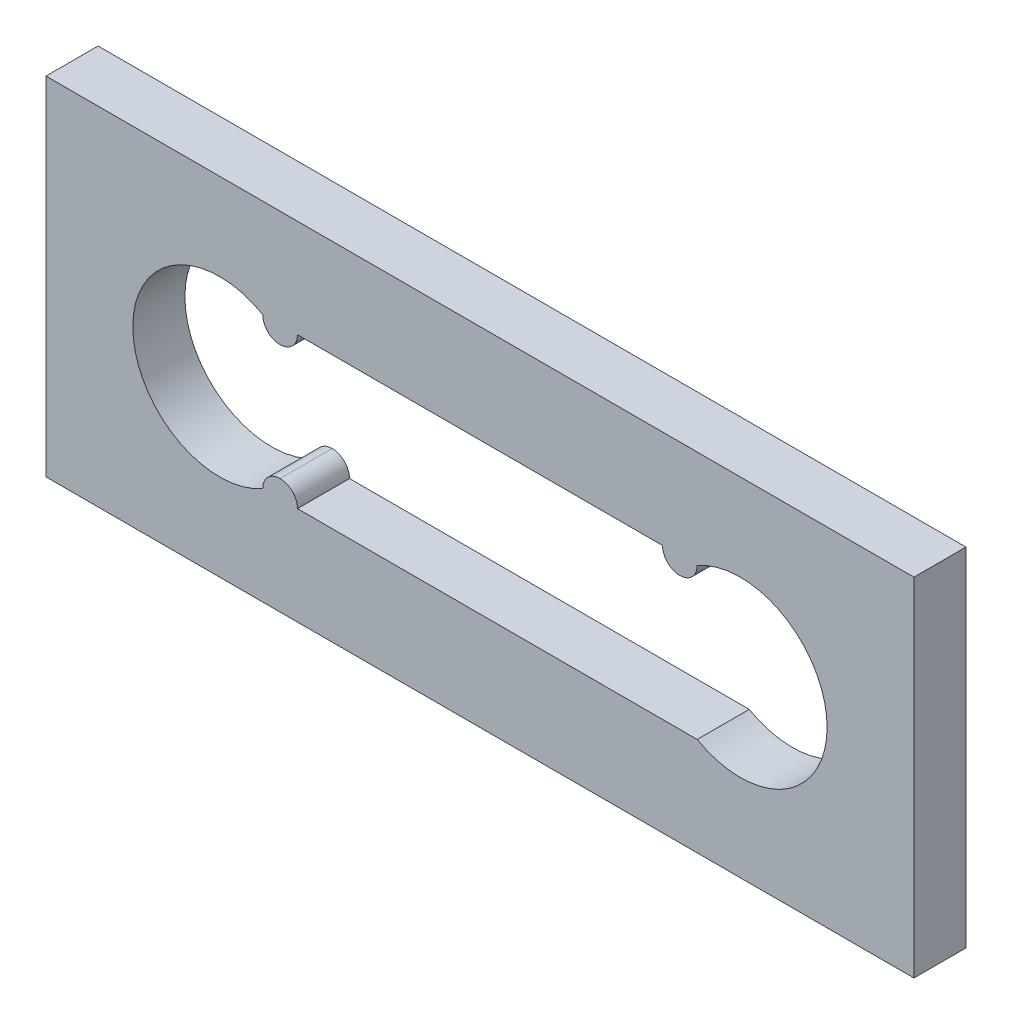
ISO-10303-21;
HEADER;
FILE_DESCRIPTION(('STEP AP214'),'2;1');
FILE_NAME('part.step','',(''),(''),'','','');
FILE_SCHEMA(('AUTOMOTIVE_DESIGN { 1 0 10303 214 1 1 1 1 }'));
ENDSEC;
DATA;
#1=APPLICATION_CONTEXT('core data for automotive mechanical design processes');
#2=APPLICATION_PROTOCOL_DEFINITION('international standard','automotive_design',2000,#1);
#3=PRODUCT_CONTEXT('',#1,'mechanical');
#4=PRODUCT('Part','Part','',(#3));
#5=PRODUCT_RELATED_PRODUCT_CATEGORY('part','',(#4));
#6=PRODUCT_DEFINITION_FORMATION('','',#4);
#7=PRODUCT_DEFINITION_CONTEXT('part definition',#1,'design');
#8=PRODUCT_DEFINITION('design','',#6,#7);
#9=PRODUCT_DEFINITION_SHAPE('','',#8);
#10=(LENGTH_UNIT() NAMED_UNIT(*) SI_UNIT(.MILLI.,.METRE.));
#11=(NAMED_UNIT(*) PLANE_ANGLE_UNIT() SI_UNIT($,.RADIAN.));
#12=(NAMED_UNIT(*) SI_UNIT($,.STERADIAN.) SOLID_ANGLE_UNIT());
#13=UNCERTAINTY_MEASURE_WITH_UNIT(LENGTH_MEASURE(1.E-05),#10,'distance_accuracy_value','');
#14=(GEOMETRIC_REPRESENTATION_CONTEXT(3) GLOBAL_UNCERTAINTY_ASSIGNED_CONTEXT((#13)) GLOBAL_UNIT_ASSIGNED_CONTEXT((#10,
#11,#12)) REPRESENTATION_CONTEXT('',''));
#15=CARTESIAN_POINT('',(0.,0.,0.));
#16=DIRECTION('',(0.,0.,1.));
#17=DIRECTION('',(1.,0.,0.));
#18=AXIS2_PLACEMENT_3D('',#15,#16,#17);
#19=CARTESIAN_POINT('',(-15.,-4.33902003688814,-3.));
#20=DIRECTION('',(0.,-1.,0.));
#21=DIRECTION('',(0.,0.,-1.));
#22=AXIS2_PLACEMENT_3D('',#19,#20,#21);
#23=PLANE('',#22);
#24=DIRECTION('',(0.,0.,-1.));
#25=VECTOR('',#24,1.);
#26=CARTESIAN_POINT('',(-10.5154668206113,-4.33902003688814,0.));
#27=LINE('',#26,#25);
#28=CARTESIAN_POINT('',(-10.5154668206113,-4.33902003688814,0.));
#29=VERTEX_POINT('',#28);
#30=CARTESIAN_POINT('',(-10.5154668206113,-4.33902003688814,-3.));
#31=VERTEX_POINT('',#30);
#32=EDGE_CURVE('E278',#29,#31,#27,.T.);
#33=ORIENTED_EDGE('',*,*,#32,.F.);
#34=DIRECTION('',(1.,0.,0.));
#35=VECTOR('',#34,1.);
#36=CARTESIAN_POINT('',(-15.,-4.33902003688814,0.));
#37=LINE('',#36,#35);
#38=CARTESIAN_POINT('',(12.5154668206113,-4.33902003688814,0.));
#39=VERTEX_POINT('',#38);
#40=EDGE_CURVE('E310',#29,#39,#37,.T.);
#41=ORIENTED_EDGE('',*,*,#40,.T.);
#42=DIRECTION('',(0.,0.,1.));
#43=VECTOR('',#42,1.);
#44=CARTESIAN_POINT('',(12.5154668206113,-4.33902003688814,-3.));
#45=LINE('',#44,#43);
#46=CARTESIAN_POINT('',(12.5154668206113,-4.33902003688814,-3.));
#47=VERTEX_POINT('',#46);
#48=EDGE_CURVE('E292',#39,#47,#45,.F.);
#49=ORIENTED_EDGE('',*,*,#48,.T.);
#50=DIRECTION('',(1.,0.,0.));
#51=VECTOR('',#50,1.);
#52=CARTESIAN_POINT('',(-15.,-4.33902003688814,-3.));
#53=LINE('',#52,#51);
#54=EDGE_CURVE('E285',#31,#47,#53,.T.);
#55=ORIENTED_EDGE('',*,*,#54,.F.);
#56=EDGE_LOOP('',(#33,#41,#49,#55));
#57=FACE_BOUND('',#56,.T.);
#58=ADVANCED_FACE('F69',(#57),#23,.F.);
#59=CARTESIAN_POINT('',(-15.,4.33902003688814,-3.));
#60=DIRECTION('',(0.,-1.,0.));
#61=DIRECTION('',(0.,0.,-1.));
#62=AXIS2_PLACEMENT_3D('',#59,#60,#61);
#63=PLANE('',#62);
#64=DIRECTION('',(1.,0.,0.));
#65=VECTOR('',#64,1.);
#66=CARTESIAN_POINT('',(-15.,4.33902003688814,-3.));
#67=LINE('',#66,#65);
#68=CARTESIAN_POINT('',(-10.5154668206113,4.33902003688814,-3.));
#69=VERTEX_POINT('',#68);
#70=CARTESIAN_POINT('',(10.5154668206113,4.33902003688814,-3.));
#71=VERTEX_POINT('',#70);
#72=EDGE_CURVE('E294',#69,#71,#67,.T.);
#73=ORIENTED_EDGE('',*,*,#72,.T.);
#74=DIRECTION('',(0.,0.,-1.));
#75=VECTOR('',#74,1.);
#76=CARTESIAN_POINT('',(10.5154668206113,4.33902003688814,0.));
#77=LINE('',#76,#75);
#78=CARTESIAN_POINT('',(10.5154668206113,4.33902003688814,0.));
#79=VERTEX_POINT('',#78);
#80=EDGE_CURVE('E273',#79,#71,#77,.T.);
#81=ORIENTED_EDGE('',*,*,#80,.F.);
#82=DIRECTION('',(1.,0.,0.));
#83=VECTOR('',#82,1.);
#84=CARTESIAN_POINT('',(-15.,4.33902003688814,0.));
#85=LINE('',#84,#83);
#86=CARTESIAN_POINT('',(-10.5154668206113,4.33902003688814,0.));
#87=VERTEX_POINT('',#86);
#88=EDGE_CURVE('E312',#87,#79,#85,.T.);
#89=ORIENTED_EDGE('',*,*,#88,.F.);
#90=DIRECTION('',(0.,0.,1.));
#91=VECTOR('',#90,1.);
#92=CARTESIAN_POINT('',(-10.5154668206113,4.33902003688814,0.));
#93=LINE('',#92,#91);
#94=EDGE_CURVE('E303',#69,#87,#93,.T.);
#95=ORIENTED_EDGE('',*,*,#94,.F.);
#96=EDGE_LOOP('',(#73,#81,#89,#95));
#97=FACE_BOUND('',#96,.T.);
#98=ADVANCED_FACE('F343',(#97),#63,.T.);
#99=CARTESIAN_POINT('',(0.,0.,-3.));
#100=DIRECTION('',(0.,0.,-1.));
#101=DIRECTION('',(-1.,0.,0.));
#102=AXIS2_PLACEMENT_3D('',#99,#100,#101);
#103=PLANE('',#102);
#104=DIRECTION('',(0.,1.,0.));
#105=VECTOR('',#104,1.);
#106=CARTESIAN_POINT('',(-25.,-10.,-3.));
#107=LINE('',#106,#105);
#108=CARTESIAN_POINT('',(-25.,-10.,-3.));
#109=VERTEX_POINT('',#108);
#110=CARTESIAN_POINT('',(-25.,10.,-3.));
#111=VERTEX_POINT('',#110);
#112=EDGE_CURVE('E202',#109,#111,#107,.T.);
#113=ORIENTED_EDGE('',*,*,#112,.T.);
#114=DIRECTION('',(1.,0.,0.));
#115=VECTOR('',#114,1.);
#116=CARTESIAN_POINT('',(-25.,10.,-3.));
#117=LINE('',#116,#115);
#118=CARTESIAN_POINT('',(25.,10.,-3.));
#119=VERTEX_POINT('',#118);
#120=EDGE_CURVE('E206',#111,#119,#117,.T.);
#121=ORIENTED_EDGE('',*,*,#120,.T.);
#122=DIRECTION('',(0.,1.,0.));
#123=VECTOR('',#122,1.);
#124=CARTESIAN_POINT('',(25.,-10.,-3.));
#125=LINE('',#124,#123);
#126=CARTESIAN_POINT('',(25.,-10.,-3.));
#127=VERTEX_POINT('',#126);
#128=EDGE_CURVE('E210',#127,#119,#125,.T.);
#129=ORIENTED_EDGE('',*,*,#128,.F.);
#130=DIRECTION('',(1.,0.,0.));
#131=VECTOR('',#130,1.);
#132=CARTESIAN_POINT('',(-25.,-10.,-3.));
#133=LINE('',#132,#131);
#134=EDGE_CURVE('E214',#109,#127,#133,.T.);
#135=ORIENTED_EDGE('',*,*,#134,.F.);
#136=EDGE_LOOP('',(#113,#121,#129,#135));
#137=FACE_BOUND('',#136,.T.);
#138=CARTESIAN_POINT('',(-15.,0.,-3.));
#139=DIRECTION('',(0.,0.,1.));
#140=DIRECTION('',(1.,0.,0.));
#141=AXIS2_PLACEMENT_3D('',#138,#139,#140);
#142=CIRCLE('',#141,5.);
#143=CARTESIAN_POINT('',(-12.5154668206113,4.33902003688814,-3.));
#144=VERTEX_POINT('',#143);
#145=CARTESIAN_POINT('',(-12.5154668206113,-4.33902003688814,-3.));
#146=VERTEX_POINT('',#145);
#147=EDGE_CURVE('E188',#144,#146,#142,.T.);
#148=ORIENTED_EDGE('',*,*,#147,.T.);
#149=CARTESIAN_POINT('',(-11.5154668206113,-4.33902003688814,-3.));
#150=DIRECTION('',(0.,0.,-1.));
#151=DIRECTION('',(-1.,0.,0.));
#152=AXIS2_PLACEMENT_3D('',#149,#150,#151);
#153=CIRCLE('',#152,1.);
#154=CARTESIAN_POINT('',(-11.5154668206113,-3.33902003688814,-3.));
#155=VERTEX_POINT('',#154);
#156=EDGE_CURVE('E12',#146,#155,#153,.T.);
#157=ORIENTED_EDGE('',*,*,#156,.T.);
#158=CARTESIAN_POINT('',(-11.5154668206113,-4.33902003688814,-3.));
#159=DIRECTION('',(0.,0.,-1.));
#160=DIRECTION('',(-1.,0.,0.));
#161=AXIS2_PLACEMENT_3D('',#158,#159,#160);
#162=CIRCLE('',#161,1.);
#163=EDGE_CURVE('E79',#155,#31,#162,.T.);
#164=ORIENTED_EDGE('',*,*,#163,.T.);
#165=ORIENTED_EDGE('',*,*,#54,.T.);
#166=CARTESIAN_POINT('',(15.,0.,-3.));
#167=DIRECTION('',(0.,0.,1.));
#168=DIRECTION('',(1.,0.,0.));
#169=AXIS2_PLACEMENT_3D('',#166,#167,#168);
#170=CIRCLE('',#169,5.);
#171=CARTESIAN_POINT('',(12.5154668206113,4.33902003688814,-3.));
#172=VERTEX_POINT('',#171);
#173=EDGE_CURVE('E316',#47,#172,#170,.T.);
#174=ORIENTED_EDGE('',*,*,#173,.T.);
#175=CARTESIAN_POINT('',(11.5154668206113,4.33902003688814,-3.));
#176=DIRECTION('',(0.,0.,-1.));
#177=DIRECTION('',(-1.,0.,0.));
#178=AXIS2_PLACEMENT_3D('',#175,#176,#177);
#179=CIRCLE('',#178,1.);
#180=CARTESIAN_POINT('',(11.5154668206113,3.33902003688814,-3.));
#181=VERTEX_POINT('',#180);
#182=EDGE_CURVE('E266',#172,#181,#179,.T.);
#183=ORIENTED_EDGE('',*,*,#182,.T.);
#184=CARTESIAN_POINT('',(11.5154668206113,4.33902003688814,-3.));
#185=DIRECTION('',(0.,0.,-1.));
#186=DIRECTION('',(-1.,0.,0.));
#187=AXIS2_PLACEMENT_3D('',#184,#185,#186);
#188=CIRCLE('',#187,1.);
#189=EDGE_CURVE('E263',#181,#71,#188,.T.);
#190=ORIENTED_EDGE('',*,*,#189,.T.);
#191=ORIENTED_EDGE('',*,*,#72,.F.);
#192=CARTESIAN_POINT('',(-11.5154668206113,4.33902003688814,-3.));
#193=DIRECTION('',(0.,0.,-1.));
#194=DIRECTION('',(-1.,0.,0.));
#195=AXIS2_PLACEMENT_3D('',#192,#193,#194);
#196=CIRCLE('',#195,1.);
#197=CARTESIAN_POINT('',(-11.5154668206113,3.33902003688814,-3.));
#198=VERTEX_POINT('',#197);
#199=EDGE_CURVE('E260',#69,#198,#196,.T.);
#200=ORIENTED_EDGE('',*,*,#199,.T.);
#201=CARTESIAN_POINT('',(-11.5154668206113,4.33902003688814,-3.));
#202=DIRECTION('',(0.,0.,-1.));
#203=DIRECTION('',(-1.,0.,0.));
#204=AXIS2_PLACEMENT_3D('',#201,#202,#203);
#205=CIRCLE('',#204,1.);
#206=EDGE_CURVE('E257',#198,#144,#205,.T.);
#207=ORIENTED_EDGE('',*,*,#206,.T.);
#208=EDGE_LOOP('',(#148,#157,#164,#165,#174,#183,#190,#191,#200,#207));
#209=FACE_BOUND('',#208,.T.);
#210=ADVANCED_FACE('F283',(#137,#209),#103,.T.);
#211=CARTESIAN_POINT('',(0.,0.,0.));
#212=DIRECTION('',(0.,0.,-1.));
#213=DIRECTION('',(-1.,0.,0.));
#214=AXIS2_PLACEMENT_3D('',#211,#212,#213);
#215=PLANE('',#214);
#216=DIRECTION('',(0.,1.,0.));
#217=VECTOR('',#216,1.);
#218=CARTESIAN_POINT('',(-25.,-10.,0.));
#219=LINE('',#218,#217);
#220=CARTESIAN_POINT('',(-25.,-10.,0.));
#221=VERTEX_POINT('',#220);
#222=CARTESIAN_POINT('',(-25.,10.,0.));
#223=VERTEX_POINT('',#222);
#224=EDGE_CURVE('E196',#221,#223,#219,.T.);
#225=ORIENTED_EDGE('',*,*,#224,.F.);
#226=DIRECTION('',(1.,0.,0.));
#227=VECTOR('',#226,1.);
#228=CARTESIAN_POINT('',(-25.,-10.,0.));
#229=LINE('',#228,#227);
#230=CARTESIAN_POINT('',(25.,-10.,0.));
#231=VERTEX_POINT('',#230);
#232=EDGE_CURVE('E207',#221,#231,#229,.T.);
#233=ORIENTED_EDGE('',*,*,#232,.T.);
#234=DIRECTION('',(0.,1.,0.));
#235=VECTOR('',#234,1.);
#236=CARTESIAN_POINT('',(25.,-10.,0.));
#237=LINE('',#236,#235);
#238=CARTESIAN_POINT('',(25.,10.,0.));
#239=VERTEX_POINT('',#238);
#240=EDGE_CURVE('E226',#231,#239,#237,.T.);
#241=ORIENTED_EDGE('',*,*,#240,.T.);
#242=DIRECTION('',(1.,0.,0.));
#243=VECTOR('',#242,1.);
#244=CARTESIAN_POINT('',(-25.,10.,0.));
#245=LINE('',#244,#243);
#246=EDGE_CURVE('E222',#223,#239,#245,.T.);
#247=ORIENTED_EDGE('',*,*,#246,.F.);
#248=EDGE_LOOP('',(#225,#233,#241,#247));
#249=FACE_BOUND('',#248,.T.);
#250=CARTESIAN_POINT('',(-11.5154668206113,-4.33902003688814,0.));
#251=DIRECTION('',(0.,0.,-1.));
#252=DIRECTION('',(-1.,0.,0.));
#253=AXIS2_PLACEMENT_3D('',#250,#251,#252);
#254=CIRCLE('',#253,1.);
#255=CARTESIAN_POINT('',(-11.5154668206113,-3.33902003688814,0.));
#256=VERTEX_POINT('',#255);
#257=EDGE_CURVE('E92',#29,#256,#254,.F.);
#258=ORIENTED_EDGE('',*,*,#257,.T.);
#259=CARTESIAN_POINT('',(-11.5154668206113,-4.33902003688814,0.));
#260=DIRECTION('',(0.,0.,-1.));
#261=DIRECTION('',(-1.,0.,0.));
#262=AXIS2_PLACEMENT_3D('',#259,#260,#261);
#263=CIRCLE('',#262,1.);
#264=CARTESIAN_POINT('',(-12.5154668206113,-4.33902003688814,0.));
#265=VERTEX_POINT('',#264);
#266=EDGE_CURVE('E170',#256,#265,#263,.F.);
#267=ORIENTED_EDGE('',*,*,#266,.T.);
#268=CARTESIAN_POINT('',(-15.,0.,0.));
#269=DIRECTION('',(0.,0.,1.));
#270=DIRECTION('',(1.,0.,0.));
#271=AXIS2_PLACEMENT_3D('',#268,#269,#270);
#272=CIRCLE('',#271,5.);
#273=CARTESIAN_POINT('',(-12.5154668206113,4.33902003688814,0.));
#274=VERTEX_POINT('',#273);
#275=EDGE_CURVE('E173',#274,#265,#272,.T.);
#276=ORIENTED_EDGE('',*,*,#275,.F.);
#277=CARTESIAN_POINT('',(-11.5154668206113,4.33902003688814,0.));
#278=DIRECTION('',(0.,0.,-1.));
#279=DIRECTION('',(-1.,0.,0.));
#280=AXIS2_PLACEMENT_3D('',#277,#278,#279);
#281=CIRCLE('',#280,1.);
#282=CARTESIAN_POINT('',(-11.5154668206113,3.33902003688814,0.));
#283=VERTEX_POINT('',#282);
#284=EDGE_CURVE('E245',#274,#283,#281,.F.);
#285=ORIENTED_EDGE('',*,*,#284,.T.);
#286=CARTESIAN_POINT('',(-11.5154668206113,4.33902003688814,0.));
#287=DIRECTION('',(0.,0.,-1.));
#288=DIRECTION('',(-1.,0.,0.));
#289=AXIS2_PLACEMENT_3D('',#286,#287,#288);
#290=CIRCLE('',#289,1.);
#291=EDGE_CURVE('E248',#283,#87,#290,.F.);
#292=ORIENTED_EDGE('',*,*,#291,.T.);
#293=ORIENTED_EDGE('',*,*,#88,.T.);
#294=CARTESIAN_POINT('',(11.5154668206113,4.33902003688814,0.));
#295=DIRECTION('',(0.,0.,-1.));
#296=DIRECTION('',(-1.,0.,0.));
#297=AXIS2_PLACEMENT_3D('',#294,#295,#296);
#298=CIRCLE('',#297,1.);
#299=CARTESIAN_POINT('',(11.5154668206113,3.33902003688814,0.));
#300=VERTEX_POINT('',#299);
#301=EDGE_CURVE('E251',#79,#300,#298,.F.);
#302=ORIENTED_EDGE('',*,*,#301,.T.);
#303=CARTESIAN_POINT('',(11.5154668206113,4.33902003688814,0.));
#304=DIRECTION('',(0.,0.,-1.));
#305=DIRECTION('',(-1.,0.,0.));
#306=AXIS2_PLACEMENT_3D('',#303,#304,#305);
#307=CIRCLE('',#306,1.);
#308=CARTESIAN_POINT('',(12.5154668206113,4.33902003688814,0.));
#309=VERTEX_POINT('',#308);
#310=EDGE_CURVE('E254',#300,#309,#307,.F.);
#311=ORIENTED_EDGE('',*,*,#310,.T.);
#312=CARTESIAN_POINT('',(15.,0.,0.));
#313=DIRECTION('',(0.,0.,1.));
#314=DIRECTION('',(1.,0.,0.));
#315=AXIS2_PLACEMENT_3D('',#312,#313,#314);
#316=CIRCLE('',#315,5.);
#317=EDGE_CURVE('E306',#39,#309,#316,.T.);
#318=ORIENTED_EDGE('',*,*,#317,.F.);
#319=ORIENTED_EDGE('',*,*,#40,.F.);
#320=EDGE_LOOP('',(#258,#267,#276,#285,#292,#293,#302,#311,#318,#319));
#321=FACE_BOUND('',#320,.T.);
#322=ADVANCED_FACE('F172',(#249,#321),#215,.F.);
#323=CARTESIAN_POINT('',(-25.,-10.,-3.));
#324=DIRECTION('',(1.,0.,0.));
#325=DIRECTION('',(0.,0.,-1.));
#326=AXIS2_PLACEMENT_3D('',#323,#324,#325);
#327=PLANE('',#326);
#328=ORIENTED_EDGE('',*,*,#224,.T.);
#329=DIRECTION('',(0.,0.,1.));
#330=VECTOR('',#329,1.);
#331=CARTESIAN_POINT('',(-25.,10.,-3.));
#332=LINE('',#331,#330);
#333=EDGE_CURVE('E241',#111,#223,#332,.T.);
#334=ORIENTED_EDGE('',*,*,#333,.F.);
#335=ORIENTED_EDGE('',*,*,#112,.F.);
#336=DIRECTION('',(0.,0.,1.));
#337=VECTOR('',#336,1.);
#338=CARTESIAN_POINT('',(-25.,-10.,-3.));
#339=LINE('',#338,#337);
#340=EDGE_CURVE('E218',#109,#221,#339,.T.);
#341=ORIENTED_EDGE('',*,*,#340,.T.);
#342=EDGE_LOOP('',(#328,#334,#335,#341));
#343=FACE_BOUND('',#342,.T.);
#344=ADVANCED_FACE('F373',(#343),#327,.F.);
#345=CARTESIAN_POINT('',(-25.,10.,-3.));
#346=DIRECTION('',(0.,-1.,0.));
#347=DIRECTION('',(0.,0.,-1.));
#348=AXIS2_PLACEMENT_3D('',#345,#346,#347);
#349=PLANE('',#348);
#350=ORIENTED_EDGE('',*,*,#246,.T.);
#351=DIRECTION('',(0.,0.,1.));
#352=VECTOR('',#351,1.);
#353=CARTESIAN_POINT('',(25.,10.,-3.));
#354=LINE('',#353,#352);
#355=EDGE_CURVE('E238',#119,#239,#354,.T.);
#356=ORIENTED_EDGE('',*,*,#355,.F.);
#357=ORIENTED_EDGE('',*,*,#120,.F.);
#358=ORIENTED_EDGE('',*,*,#333,.T.);
#359=EDGE_LOOP('',(#350,#356,#357,#358));
#360=FACE_BOUND('',#359,.T.);
#361=ADVANCED_FACE('F382',(#360),#349,.F.);
#362=CARTESIAN_POINT('',(25.,-10.,-3.));
#363=DIRECTION('',(1.,0.,0.));
#364=DIRECTION('',(0.,0.,-1.));
#365=AXIS2_PLACEMENT_3D('',#362,#363,#364);
#366=PLANE('',#365);
#367=ORIENTED_EDGE('',*,*,#240,.F.);
#368=DIRECTION('',(0.,0.,1.));
#369=VECTOR('',#368,1.);
#370=CARTESIAN_POINT('',(25.,-10.,-3.));
#371=LINE('',#370,#369);
#372=EDGE_CURVE('E235',#127,#231,#371,.T.);
#373=ORIENTED_EDGE('',*,*,#372,.F.);
#374=ORIENTED_EDGE('',*,*,#128,.T.);
#375=ORIENTED_EDGE('',*,*,#355,.T.);
#376=EDGE_LOOP('',(#367,#373,#374,#375));
#377=FACE_BOUND('',#376,.T.);
#378=ADVANCED_FACE('F378',(#377),#366,.T.);
#379=CARTESIAN_POINT('',(-25.,-10.,-3.));
#380=DIRECTION('',(0.,-1.,0.));
#381=DIRECTION('',(0.,0.,-1.));
#382=AXIS2_PLACEMENT_3D('',#379,#380,#381);
#383=PLANE('',#382);
#384=ORIENTED_EDGE('',*,*,#232,.F.);
#385=ORIENTED_EDGE('',*,*,#340,.F.);
#386=ORIENTED_EDGE('',*,*,#134,.T.);
#387=ORIENTED_EDGE('',*,*,#372,.T.);
#388=EDGE_LOOP('',(#384,#385,#386,#387));
#389=FACE_BOUND('',#388,.T.);
#390=ADVANCED_FACE('F375',(#389),#383,.T.);
#391=CARTESIAN_POINT('',(-15.,0.,-3.));
#392=DIRECTION('',(0.,0.,1.));
#393=DIRECTION('',(1.,0.,0.));
#394=AXIS2_PLACEMENT_3D('',#391,#392,#393);
#395=CYLINDRICAL_SURFACE('',#394,5.);
#396=ORIENTED_EDGE('',*,*,#275,.T.);
#397=DIRECTION('',(0.,0.,1.));
#398=VECTOR('',#397,1.);
#399=CARTESIAN_POINT('',(-12.5154668206113,-4.33902003688814,-3.));
#400=LINE('',#399,#398);
#401=EDGE_CURVE('E184',#265,#146,#400,.F.);
#402=ORIENTED_EDGE('',*,*,#401,.T.);
#403=ORIENTED_EDGE('',*,*,#147,.F.);
#404=DIRECTION('',(0.,0.,1.));
#405=VECTOR('',#404,1.);
#406=CARTESIAN_POINT('',(-12.5154668206113,4.33902003688814,-3.));
#407=LINE('',#406,#405);
#408=EDGE_CURVE('E186',#274,#144,#407,.F.);
#409=ORIENTED_EDGE('',*,*,#408,.F.);
#410=EDGE_LOOP('',(#396,#402,#403,#409));
#411=FACE_BOUND('',#410,.T.);
#412=ADVANCED_FACE('F182',(#411),#395,.F.);
#413=CARTESIAN_POINT('',(15.,0.,-3.));
#414=DIRECTION('',(0.,0.,1.));
#415=DIRECTION('',(1.,0.,0.));
#416=AXIS2_PLACEMENT_3D('',#413,#414,#415);
#417=CYLINDRICAL_SURFACE('',#416,5.);
#418=DIRECTION('',(0.,0.,1.));
#419=VECTOR('',#418,1.);
#420=CARTESIAN_POINT('',(12.5154668206113,4.33902003688814,-3.));
#421=LINE('',#420,#419);
#422=EDGE_CURVE('E189',#309,#172,#421,.F.);
#423=ORIENTED_EDGE('',*,*,#422,.T.);
#424=ORIENTED_EDGE('',*,*,#173,.F.);
#425=ORIENTED_EDGE('',*,*,#48,.F.);
#426=ORIENTED_EDGE('',*,*,#317,.T.);
#427=EDGE_LOOP('',(#423,#424,#425,#426));
#428=FACE_BOUND('',#427,.T.);
#429=ADVANCED_FACE('F328',(#428),#417,.F.);
#430=CARTESIAN_POINT('',(11.5154668206113,4.33902003688814,0.));
#431=DIRECTION('',(0.,0.,-1.));
#432=DIRECTION('',(-1.,0.,0.));
#433=AXIS2_PLACEMENT_3D('',#430,#431,#432);
#434=CYLINDRICAL_SURFACE('',#433,1.);
#435=ORIENTED_EDGE('',*,*,#80,.T.);
#436=ORIENTED_EDGE('',*,*,#189,.F.);
#437=DIRECTION('',(0.,0.,-1.));
#438=VECTOR('',#437,1.);
#439=CARTESIAN_POINT('',(11.5154668206113,3.33902003688814,0.));
#440=LINE('',#439,#438);
#441=EDGE_CURVE('E269',#300,#181,#440,.T.);
#442=ORIENTED_EDGE('',*,*,#441,.F.);
#443=ORIENTED_EDGE('',*,*,#301,.F.);
#444=EDGE_LOOP('',(#435,#436,#442,#443));
#445=FACE_BOUND('',#444,.T.);
#446=ADVANCED_FACE('F336',(#445),#434,.T.);
#447=CARTESIAN_POINT('',(11.5154668206113,4.33902003688814,0.));
#448=DIRECTION('',(0.,0.,1.));
#449=DIRECTION('',(1.,0.,0.));
#450=AXIS2_PLACEMENT_3D('',#447,#448,#449);
#451=CYLINDRICAL_SURFACE('',#450,1.);
#452=ORIENTED_EDGE('',*,*,#182,.F.);
#453=ORIENTED_EDGE('',*,*,#422,.F.);
#454=ORIENTED_EDGE('',*,*,#310,.F.);
#455=ORIENTED_EDGE('',*,*,#441,.T.);
#456=EDGE_LOOP('',(#452,#453,#454,#455));
#457=FACE_BOUND('',#456,.T.);
#458=ADVANCED_FACE('F338',(#457),#451,.T.);
#459=CARTESIAN_POINT('',(-11.5154668206113,4.33902003688814,0.));
#460=DIRECTION('',(0.,0.,1.));
#461=DIRECTION('',(1.,0.,0.));
#462=AXIS2_PLACEMENT_3D('',#459,#460,#461);
#463=CYLINDRICAL_SURFACE('',#462,1.);
#464=ORIENTED_EDGE('',*,*,#408,.T.);
#465=ORIENTED_EDGE('',*,*,#206,.F.);
#466=DIRECTION('',(0.,0.,-1.));
#467=VECTOR('',#466,1.);
#468=CARTESIAN_POINT('',(-11.5154668206113,3.33902003688814,-3.));
#469=LINE('',#468,#467);
#470=EDGE_CURVE('E274',#283,#198,#469,.T.);
#471=ORIENTED_EDGE('',*,*,#470,.F.);
#472=ORIENTED_EDGE('',*,*,#284,.F.);
#473=EDGE_LOOP('',(#464,#465,#471,#472));
#474=FACE_BOUND('',#473,.T.);
#475=ADVANCED_FACE('F349',(#474),#463,.T.);
#476=CARTESIAN_POINT('',(-11.5154668206113,4.33902003688814,0.));
#477=DIRECTION('',(0.,0.,-1.));
#478=DIRECTION('',(-1.,0.,0.));
#479=AXIS2_PLACEMENT_3D('',#476,#477,#478);
#480=CYLINDRICAL_SURFACE('',#479,1.);
#481=ORIENTED_EDGE('',*,*,#199,.F.);
#482=ORIENTED_EDGE('',*,*,#94,.T.);
#483=ORIENTED_EDGE('',*,*,#291,.F.);
#484=ORIENTED_EDGE('',*,*,#470,.T.);
#485=EDGE_LOOP('',(#481,#482,#483,#484));
#486=FACE_BOUND('',#485,.T.);
#487=ADVANCED_FACE('F345',(#486),#480,.T.);
#488=CARTESIAN_POINT('',(-11.5154668206113,-4.33902003688814,0.));
#489=DIRECTION('',(0.,0.,-1.));
#490=DIRECTION('',(-1.,0.,0.));
#491=AXIS2_PLACEMENT_3D('',#488,#489,#490);
#492=CYLINDRICAL_SURFACE('',#491,1.);
#493=ORIENTED_EDGE('',*,*,#32,.T.);
#494=ORIENTED_EDGE('',*,*,#163,.F.);
#495=DIRECTION('',(0.,0.,-1.));
#496=VECTOR('',#495,1.);
#497=CARTESIAN_POINT('',(-11.5154668206113,-3.33902003688814,0.));
#498=LINE('',#497,#496);
#499=EDGE_CURVE('E73',#256,#155,#498,.T.);
#500=ORIENTED_EDGE('',*,*,#499,.F.);
#501=ORIENTED_EDGE('',*,*,#257,.F.);
#502=EDGE_LOOP('',(#493,#494,#500,#501));
#503=FACE_BOUND('',#502,.T.);
#504=ADVANCED_FACE('F71',(#503),#492,.T.);
#505=CARTESIAN_POINT('',(-11.5154668206113,-4.33902003688814,0.));
#506=DIRECTION('',(0.,0.,1.));
#507=DIRECTION('',(1.,0.,0.));
#508=AXIS2_PLACEMENT_3D('',#505,#506,#507);
#509=CYLINDRICAL_SURFACE('',#508,1.);
#510=ORIENTED_EDGE('',*,*,#156,.F.);
#511=ORIENTED_EDGE('',*,*,#401,.F.);
#512=ORIENTED_EDGE('',*,*,#266,.F.);
#513=ORIENTED_EDGE('',*,*,#499,.T.);
#514=EDGE_LOOP('',(#510,#511,#512,#513));
#515=FACE_BOUND('',#514,.T.);
#516=ADVANCED_FACE('F191',(#515),#509,.T.);
#517=CLOSED_SHELL('',(#58,#98,#210,#322,#344,#361,#378,#390,#412,#429,#446,#458,#475,#487,#504,#516));
#518=MANIFOLD_SOLID_BREP('B2',#517);
#519=ADVANCED_BREP_SHAPE_REPRESENTATION('',(#18,#518),#14);
#520=SHAPE_DEFINITION_REPRESENTATION(#9,#519);
ENDSEC;
END-ISO-10303-21;
